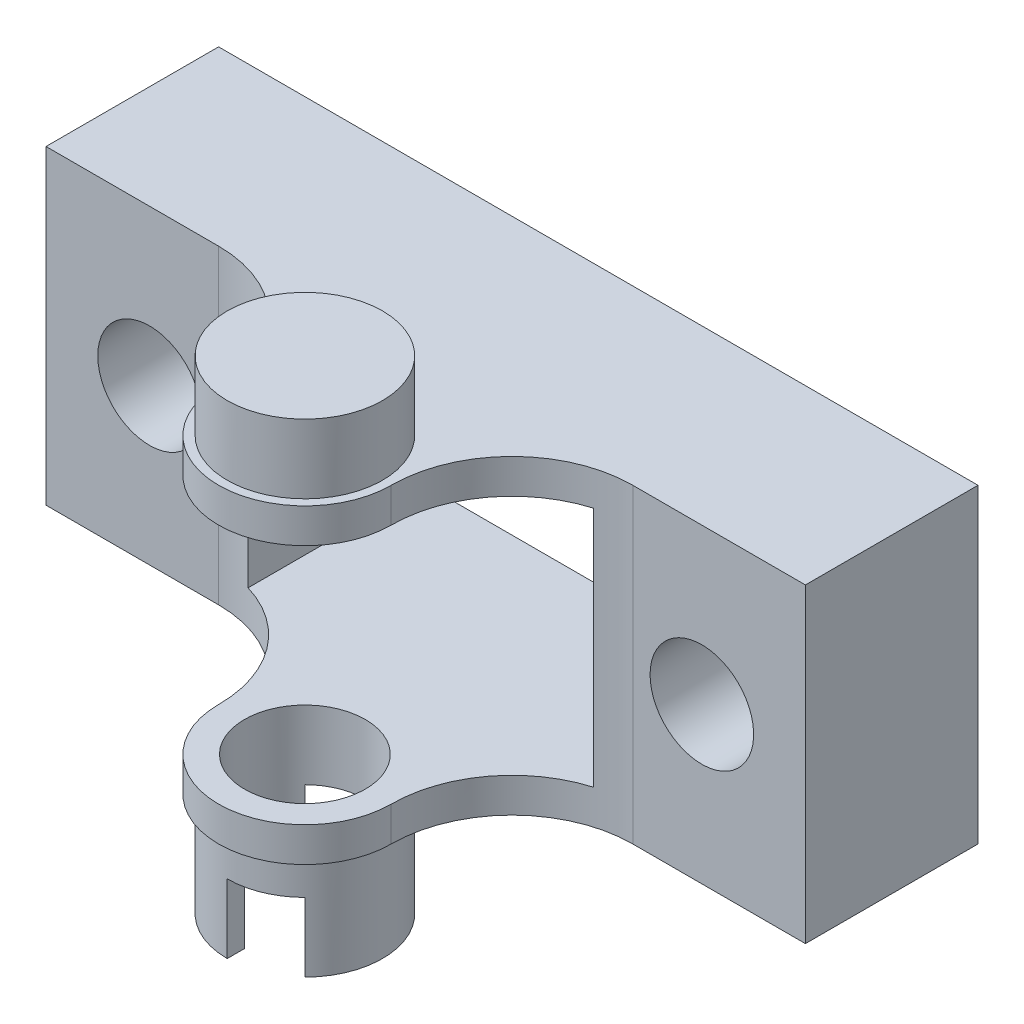
ISO-10303-21;
HEADER;
FILE_DESCRIPTION(('STEP AP214'),'2;1');
FILE_NAME('part.step','',(''),(''),'','','');
FILE_SCHEMA(('AUTOMOTIVE_DESIGN { 1 0 10303 214 1 1 1 1 }'));
ENDSEC;
DATA;
#1=APPLICATION_CONTEXT('core data for automotive mechanical design processes');
#2=APPLICATION_PROTOCOL_DEFINITION('international standard','automotive_design',2000,#1);
#3=PRODUCT_CONTEXT('',#1,'mechanical');
#4=PRODUCT('Part','Part','',(#3));
#5=PRODUCT_RELATED_PRODUCT_CATEGORY('part','',(#4));
#6=PRODUCT_DEFINITION_FORMATION('','',#4);
#7=PRODUCT_DEFINITION_CONTEXT('part definition',#1,'design');
#8=PRODUCT_DEFINITION('design','',#6,#7);
#9=PRODUCT_DEFINITION_SHAPE('','',#8);
#10=(LENGTH_UNIT() NAMED_UNIT(*) SI_UNIT(.MILLI.,.METRE.));
#11=(NAMED_UNIT(*) PLANE_ANGLE_UNIT() SI_UNIT($,.RADIAN.));
#12=(NAMED_UNIT(*) SI_UNIT($,.STERADIAN.) SOLID_ANGLE_UNIT());
#13=UNCERTAINTY_MEASURE_WITH_UNIT(LENGTH_MEASURE(1.E-05),#10,'distance_accuracy_value','');
#14=(GEOMETRIC_REPRESENTATION_CONTEXT(3) GLOBAL_UNCERTAINTY_ASSIGNED_CONTEXT((#13)) GLOBAL_UNIT_ASSIGNED_CONTEXT((#10,
#11,#12)) REPRESENTATION_CONTEXT('',''));
#15=CARTESIAN_POINT('',(0.,0.,0.));
#16=DIRECTION('',(0.,0.,1.));
#17=DIRECTION('',(1.,0.,0.));
#18=AXIS2_PLACEMENT_3D('',#15,#16,#17);
#19=CARTESIAN_POINT('',(36.,0.,14.5));
#20=DIRECTION('',(0.,1.,0.));
#21=DIRECTION('',(0.,0.,1.));
#22=AXIS2_PLACEMENT_3D('',#19,#20,#21);
#23=CYLINDRICAL_SURFACE('',#22,1.75);
#24=CARTESIAN_POINT('',(36.,339.,14.5));
#25=DIRECTION('',(0.,1.,0.));
#26=DIRECTION('',(0.,0.,1.));
#27=AXIS2_PLACEMENT_3D('',#24,#25,#26);
#28=CIRCLE('',#27,1.75);
#29=CARTESIAN_POINT('',(36.,339.,16.25));
#30=VERTEX_POINT('',#29);
#31=EDGE_CURVE('E385',#30,#30,#28,.T.);
#32=ORIENTED_EDGE('',*,*,#31,.F.);
#33=EDGE_LOOP('',(#32));
#34=FACE_BOUND('',#33,.T.);
#35=CARTESIAN_POINT('',(36.,341.,14.5));
#36=DIRECTION('',(0.,1.,0.));
#37=DIRECTION('',(0.,0.,1.));
#38=AXIS2_PLACEMENT_3D('',#35,#36,#37);
#39=CIRCLE('',#38,1.75);
#40=CARTESIAN_POINT('',(36.,341.,16.25));
#41=VERTEX_POINT('',#40);
#42=EDGE_CURVE('E14',#41,#41,#39,.F.);
#43=ORIENTED_EDGE('',*,*,#42,.F.);
#44=EDGE_LOOP('',(#43));
#45=FACE_BOUND('',#44,.T.);
#46=ADVANCED_FACE('F107',(#34,#45),#23,.F.);
#47=CARTESIAN_POINT('',(36.,343.,14.5));
#48=DIRECTION('',(0.,-1.,0.));
#49=DIRECTION('',(0.,0.,-1.));
#50=AXIS2_PLACEMENT_3D('',#47,#48,#49);
#51=CYLINDRICAL_SURFACE('',#50,2.25);
#52=CARTESIAN_POINT('',(36.,340.,14.5));
#53=DIRECTION('',(0.,-1.,0.));
#54=DIRECTION('',(0.,0.,-1.));
#55=AXIS2_PLACEMENT_3D('',#52,#53,#54);
#56=CIRCLE('',#55,2.25);
#57=CARTESIAN_POINT('',(36.,340.,12.25));
#58=VERTEX_POINT('',#57);
#59=EDGE_CURVE('E442',#58,#58,#56,.F.);
#60=ORIENTED_EDGE('',*,*,#59,.T.);
#61=EDGE_LOOP('',(#60));
#62=FACE_BOUND('',#61,.T.);
#63=CARTESIAN_POINT('',(36.,342.,14.5));
#64=DIRECTION('',(0.,1.,0.));
#65=DIRECTION('',(0.,0.,1.));
#66=AXIS2_PLACEMENT_3D('',#63,#64,#65);
#67=CIRCLE('',#66,2.25);
#68=CARTESIAN_POINT('',(36.,342.,16.75));
#69=VERTEX_POINT('',#68);
#70=EDGE_CURVE('E316',#69,#69,#67,.T.);
#71=ORIENTED_EDGE('',*,*,#70,.F.);
#72=EDGE_LOOP('',(#71));
#73=FACE_BOUND('',#72,.T.);
#74=ADVANCED_FACE('F463',(#62,#73),#51,.T.);
#75=CARTESIAN_POINT('',(36.,332.,14.5));
#76=DIRECTION('',(0.,-1.,0.));
#77=DIRECTION('',(0.,0.,-1.));
#78=AXIS2_PLACEMENT_3D('',#75,#76,#77);
#79=CIRCLE('',#78,1.75);
#80=CARTESIAN_POINT('',(36.,332.,12.75));
#81=VERTEX_POINT('',#80);
#82=EDGE_CURVE('E389',#81,#81,#79,.T.);
#83=ORIENTED_EDGE('',*,*,#82,.F.);
#84=EDGE_LOOP('',(#83));
#85=FACE_BOUND('',#84,.T.);
#86=DIRECTION('',(0.,-1.,0.));
#87=VECTOR('',#86,1.);
#88=CARTESIAN_POINT('',(36.,330.,16.25));
#89=LINE('',#88,#87);
#90=CARTESIAN_POINT('',(36.,330.,16.25));
#91=VERTEX_POINT('',#90);
#92=CARTESIAN_POINT('',(36.,328.,16.25));
#93=VERTEX_POINT('',#92);
#94=EDGE_CURVE('E337',#91,#93,#89,.T.);
#95=ORIENTED_EDGE('',*,*,#94,.T.);
#96=CARTESIAN_POINT('',(36.,328.,14.5));
#97=DIRECTION('',(0.,-1.,0.));
#98=DIRECTION('',(0.,0.,-1.));
#99=AXIS2_PLACEMENT_3D('',#96,#97,#98);
#100=CIRCLE('',#99,1.75);
#101=CARTESIAN_POINT('',(34.7625631329235,328.,13.2625631329235));
#102=VERTEX_POINT('',#101);
#103=EDGE_CURVE('E340',#93,#102,#100,.T.);
#104=ORIENTED_EDGE('',*,*,#103,.T.);
#105=DIRECTION('',(0.,-1.,0.));
#106=VECTOR('',#105,1.);
#107=CARTESIAN_POINT('',(34.7625631329235,330.,13.2625631329235));
#108=LINE('',#107,#106);
#109=CARTESIAN_POINT('',(34.7625631329235,330.,13.2625631329235));
#110=VERTEX_POINT('',#109);
#111=EDGE_CURVE('E122',#110,#102,#108,.T.);
#112=ORIENTED_EDGE('',*,*,#111,.F.);
#113=CARTESIAN_POINT('',(36.,330.,14.5));
#114=DIRECTION('',(0.,-1.,0.));
#115=DIRECTION('',(0.,0.,-1.));
#116=AXIS2_PLACEMENT_3D('',#113,#114,#115);
#117=CIRCLE('',#116,1.75);
#118=CARTESIAN_POINT('',(36.,330.,12.75));
#119=VERTEX_POINT('',#118);
#120=EDGE_CURVE('E347',#119,#110,#117,.F.);
#121=ORIENTED_EDGE('',*,*,#120,.F.);
#122=DIRECTION('',(0.,-1.,0.));
#123=VECTOR('',#122,1.);
#124=CARTESIAN_POINT('',(36.,330.,12.75));
#125=LINE('',#124,#123);
#126=CARTESIAN_POINT('',(36.,328.,12.75));
#127=VERTEX_POINT('',#126);
#128=EDGE_CURVE('E334',#119,#127,#125,.T.);
#129=ORIENTED_EDGE('',*,*,#128,.T.);
#130=CARTESIAN_POINT('',(37.2374368670765,328.,15.7374368670765));
#131=VERTEX_POINT('',#130);
#132=EDGE_CURVE('E370',#127,#131,#100,.T.);
#133=ORIENTED_EDGE('',*,*,#132,.T.);
#134=DIRECTION('',(0.,-1.,0.));
#135=VECTOR('',#134,1.);
#136=CARTESIAN_POINT('',(37.2374368670765,330.,15.7374368670765));
#137=LINE('',#136,#135);
#138=CARTESIAN_POINT('',(37.2374368670765,330.,15.7374368670765));
#139=VERTEX_POINT('',#138);
#140=EDGE_CURVE('E130',#139,#131,#137,.T.);
#141=ORIENTED_EDGE('',*,*,#140,.F.);
#142=CARTESIAN_POINT('',(36.,330.,14.5));
#143=DIRECTION('',(0.,-1.,0.));
#144=DIRECTION('',(0.,0.,-1.));
#145=AXIS2_PLACEMENT_3D('',#142,#143,#144);
#146=CIRCLE('',#145,1.75);
#147=EDGE_CURVE('E320',#91,#139,#146,.F.);
#148=ORIENTED_EDGE('',*,*,#147,.F.);
#149=EDGE_LOOP('',(#95,#104,#112,#121,#129,#133,#141,#148));
#150=FACE_BOUND('',#149,.T.);
#151=ADVANCED_FACE('F466',(#85,#150),#23,.F.);
#152=CARTESIAN_POINT('',(36.,328.,14.5));
#153=DIRECTION('',(0.,1.,0.));
#154=DIRECTION('',(0.,0.,1.));
#155=AXIS2_PLACEMENT_3D('',#152,#153,#154);
#156=CYLINDRICAL_SURFACE('',#155,2.25);
#157=CARTESIAN_POINT('',(36.,331.,14.5));
#158=DIRECTION('',(0.,1.,0.));
#159=DIRECTION('',(0.,0.,1.));
#160=AXIS2_PLACEMENT_3D('',#157,#158,#159);
#161=CIRCLE('',#160,2.25);
#162=CARTESIAN_POINT('',(36.,331.,16.75));
#163=VERTEX_POINT('',#162);
#164=EDGE_CURVE('E115',#163,#163,#161,.F.);
#165=ORIENTED_EDGE('',*,*,#164,.T.);
#166=EDGE_LOOP('',(#165));
#167=FACE_BOUND('',#166,.T.);
#168=DIRECTION('',(0.,-1.,0.));
#169=VECTOR('',#168,1.);
#170=CARTESIAN_POINT('',(36.,330.,16.75));
#171=LINE('',#170,#169);
#172=CARTESIAN_POINT('',(36.,330.,16.75));
#173=VERTEX_POINT('',#172);
#174=CARTESIAN_POINT('',(36.,328.,16.75));
#175=VERTEX_POINT('',#174);
#176=EDGE_CURVE('E341',#173,#175,#171,.T.);
#177=ORIENTED_EDGE('',*,*,#176,.F.);
#178=CARTESIAN_POINT('',(36.,330.,14.5));
#179=DIRECTION('',(0.,-1.,0.));
#180=DIRECTION('',(0.,0.,-1.));
#181=AXIS2_PLACEMENT_3D('',#178,#179,#180);
#182=CIRCLE('',#181,2.25);
#183=CARTESIAN_POINT('',(37.5909902576697,330.,16.0909902576697));
#184=VERTEX_POINT('',#183);
#185=EDGE_CURVE('E327',#184,#173,#182,.T.);
#186=ORIENTED_EDGE('',*,*,#185,.F.);
#187=DIRECTION('',(0.,-1.,0.));
#188=VECTOR('',#187,1.);
#189=CARTESIAN_POINT('',(37.5909902576697,330.,16.0909902576697));
#190=LINE('',#189,#188);
#191=CARTESIAN_POINT('',(37.5909902576697,328.,16.0909902576697));
#192=VERTEX_POINT('',#191);
#193=EDGE_CURVE('E343',#184,#192,#190,.T.);
#194=ORIENTED_EDGE('',*,*,#193,.T.);
#195=CARTESIAN_POINT('',(36.,328.,14.5));
#196=DIRECTION('',(0.,-1.,0.));
#197=DIRECTION('',(0.,0.,-1.));
#198=AXIS2_PLACEMENT_3D('',#195,#196,#197);
#199=CIRCLE('',#198,2.25);
#200=CARTESIAN_POINT('',(36.,328.,12.25));
#201=VERTEX_POINT('',#200);
#202=EDGE_CURVE('E374',#201,#192,#199,.T.);
#203=ORIENTED_EDGE('',*,*,#202,.F.);
#204=DIRECTION('',(0.,-1.,0.));
#205=VECTOR('',#204,1.);
#206=CARTESIAN_POINT('',(36.,330.,12.25));
#207=LINE('',#206,#205);
#208=CARTESIAN_POINT('',(36.,330.,12.25));
#209=VERTEX_POINT('',#208);
#210=EDGE_CURVE('E364',#209,#201,#207,.T.);
#211=ORIENTED_EDGE('',*,*,#210,.F.);
#212=CARTESIAN_POINT('',(36.,330.,14.5));
#213=DIRECTION('',(0.,-1.,0.));
#214=DIRECTION('',(0.,0.,-1.));
#215=AXIS2_PLACEMENT_3D('',#212,#213,#214);
#216=CIRCLE('',#215,2.25);
#217=CARTESIAN_POINT('',(34.4090097423303,330.,12.9090097423303));
#218=VERTEX_POINT('',#217);
#219=EDGE_CURVE('E354',#218,#209,#216,.T.);
#220=ORIENTED_EDGE('',*,*,#219,.F.);
#221=DIRECTION('',(0.,-1.,0.));
#222=VECTOR('',#221,1.);
#223=CARTESIAN_POINT('',(34.4090097423303,330.,12.9090097423303));
#224=LINE('',#223,#222);
#225=CARTESIAN_POINT('',(34.4090097423303,328.,12.9090097423303));
#226=VERTEX_POINT('',#225);
#227=EDGE_CURVE('E366',#218,#226,#224,.T.);
#228=ORIENTED_EDGE('',*,*,#227,.T.);
#229=EDGE_CURVE('E373',#175,#226,#199,.T.);
#230=ORIENTED_EDGE('',*,*,#229,.F.);
#231=EDGE_LOOP('',(#177,#186,#194,#203,#211,#220,#228,#230));
#232=FACE_BOUND('',#231,.T.);
#233=ADVANCED_FACE('F447',(#167,#232),#156,.T.);
#234=CARTESIAN_POINT('',(36.,328.,14.5));
#235=DIRECTION('',(0.,-1.,0.));
#236=DIRECTION('',(0.,0.,-1.));
#237=AXIS2_PLACEMENT_3D('',#234,#235,#236);
#238=PLANE('',#237);
#239=ORIENTED_EDGE('',*,*,#103,.F.);
#240=DIRECTION('',(0.,0.,1.));
#241=VECTOR('',#240,1.);
#242=CARTESIAN_POINT('',(36.,328.,0.));
#243=LINE('',#242,#241);
#244=EDGE_CURVE('E324',#93,#175,#243,.T.);
#245=ORIENTED_EDGE('',*,*,#244,.T.);
#246=ORIENTED_EDGE('',*,*,#229,.T.);
#247=DIRECTION('',(-0.707106781186551,0.,-0.707106781186544));
#248=VECTOR('',#247,1.);
#249=CARTESIAN_POINT('',(10.7499999999998,328.,-10.7499999999999));
#250=LINE('',#249,#248);
#251=EDGE_CURVE('E319',#102,#226,#250,.T.);
#252=ORIENTED_EDGE('',*,*,#251,.F.);
#253=EDGE_LOOP('',(#239,#245,#246,#252));
#254=FACE_BOUND('',#253,.T.);
#255=ADVANCED_FACE('F459',(#254),#238,.T.);
#256=DIRECTION('',(0.707106781186549,0.,0.707106781186546));
#257=VECTOR('',#256,1.);
#258=CARTESIAN_POINT('',(10.7499999999999,328.,-10.75));
#259=LINE('',#258,#257);
#260=EDGE_CURVE('E332',#131,#192,#259,.T.);
#261=ORIENTED_EDGE('',*,*,#260,.F.);
#262=ORIENTED_EDGE('',*,*,#132,.F.);
#263=DIRECTION('',(0.,0.,-1.));
#264=VECTOR('',#263,1.);
#265=CARTESIAN_POINT('',(36.,328.,0.));
#266=LINE('',#265,#264);
#267=EDGE_CURVE('E351',#127,#201,#266,.T.);
#268=ORIENTED_EDGE('',*,*,#267,.T.);
#269=ORIENTED_EDGE('',*,*,#202,.T.);
#270=EDGE_LOOP('',(#261,#262,#268,#269));
#271=FACE_BOUND('',#270,.T.);
#272=ADVANCED_FACE('F452',(#271),#238,.T.);
#273=CARTESIAN_POINT('',(30.,331.,17.));
#274=DIRECTION('',(0.,1.,0.));
#275=DIRECTION('',(0.,0.,1.));
#276=AXIS2_PLACEMENT_3D('',#273,#274,#275);
#277=PLANE('',#276);
#278=ORIENTED_EDGE('',*,*,#164,.F.);
#279=EDGE_LOOP('',(#278));
#280=FACE_BOUND('',#279,.T.);
#281=CARTESIAN_POINT('',(42.,331.,14.5));
#282=DIRECTION('',(0.,1.,0.));
#283=DIRECTION('',(0.,0.,1.));
#284=AXIS2_PLACEMENT_3D('',#281,#282,#283);
#285=CIRCLE('',#284,3.5);
#286=CARTESIAN_POINT('',(42.,331.,11.));
#287=VERTEX_POINT('',#286);
#288=CARTESIAN_POINT('',(38.5,331.,14.5));
#289=VERTEX_POINT('',#288);
#290=EDGE_CURVE('E395',#287,#289,#285,.T.);
#291=ORIENTED_EDGE('',*,*,#290,.T.);
#292=CARTESIAN_POINT('',(36.,331.,14.5));
#293=DIRECTION('',(0.,1.,0.));
#294=DIRECTION('',(0.,0.,1.));
#295=AXIS2_PLACEMENT_3D('',#292,#293,#294);
#296=CIRCLE('',#295,2.5);
#297=CARTESIAN_POINT('',(33.5,331.,14.5));
#298=VERTEX_POINT('',#297);
#299=EDGE_CURVE('E409',#298,#289,#296,.T.);
#300=ORIENTED_EDGE('',*,*,#299,.F.);
#301=CARTESIAN_POINT('',(30.,331.,14.5));
#302=DIRECTION('',(0.,1.,0.));
#303=DIRECTION('',(0.,0.,1.));
#304=AXIS2_PLACEMENT_3D('',#301,#302,#303);
#305=CIRCLE('',#304,3.5);
#306=CARTESIAN_POINT('',(30.,331.,11.));
#307=VERTEX_POINT('',#306);
#308=EDGE_CURVE('E417',#298,#307,#305,.T.);
#309=ORIENTED_EDGE('',*,*,#308,.T.);
#310=DIRECTION('',(1.,0.,0.));
#311=VECTOR('',#310,1.);
#312=CARTESIAN_POINT('',(25.,331.,11.));
#313=LINE('',#312,#311);
#314=CARTESIAN_POINT('',(25.,331.,11.));
#315=VERTEX_POINT('',#314);
#316=EDGE_CURVE('E299',#315,#307,#313,.T.);
#317=ORIENTED_EDGE('',*,*,#316,.F.);
#318=DIRECTION('',(0.,0.,1.));
#319=VECTOR('',#318,1.);
#320=CARTESIAN_POINT('',(25.,331.,6.));
#321=LINE('',#320,#319);
#322=CARTESIAN_POINT('',(25.,331.,6.));
#323=VERTEX_POINT('',#322);
#324=EDGE_CURVE('E285',#323,#315,#321,.T.);
#325=ORIENTED_EDGE('',*,*,#324,.F.);
#326=DIRECTION('',(-1.,0.,0.));
#327=VECTOR('',#326,1.);
#328=CARTESIAN_POINT('',(42.,331.,6.));
#329=LINE('',#328,#327);
#330=CARTESIAN_POINT('',(47.,331.,6.));
#331=VERTEX_POINT('',#330);
#332=EDGE_CURVE('E262',#331,#323,#329,.T.);
#333=ORIENTED_EDGE('',*,*,#332,.F.);
#334=DIRECTION('',(0.,0.,-1.));
#335=VECTOR('',#334,1.);
#336=CARTESIAN_POINT('',(47.,331.,11.));
#337=LINE('',#336,#335);
#338=CARTESIAN_POINT('',(47.,331.,11.));
#339=VERTEX_POINT('',#338);
#340=EDGE_CURVE('E255',#339,#331,#337,.T.);
#341=ORIENTED_EDGE('',*,*,#340,.F.);
#342=DIRECTION('',(-1.,0.,0.));
#343=VECTOR('',#342,1.);
#344=CARTESIAN_POINT('',(47.,331.,11.));
#345=LINE('',#344,#343);
#346=EDGE_CURVE('E259',#339,#287,#345,.T.);
#347=ORIENTED_EDGE('',*,*,#346,.T.);
#348=EDGE_LOOP('',(#291,#300,#309,#317,#325,#333,#341,#347));
#349=FACE_BOUND('',#348,.T.);
#350=ADVANCED_FACE('F109',(#280,#349),#277,.F.);
#351=CARTESIAN_POINT('',(30.,340.,17.));
#352=DIRECTION('',(0.,-1.,0.));
#353=DIRECTION('',(0.,0.,-1.));
#354=AXIS2_PLACEMENT_3D('',#351,#352,#353);
#355=PLANE('',#354);
#356=ORIENTED_EDGE('',*,*,#59,.F.);
#357=EDGE_LOOP('',(#356));
#358=FACE_BOUND('',#357,.T.);
#359=CARTESIAN_POINT('',(36.,340.,14.5));
#360=DIRECTION('',(0.,1.,0.));
#361=DIRECTION('',(0.,0.,1.));
#362=AXIS2_PLACEMENT_3D('',#359,#360,#361);
#363=CIRCLE('',#362,2.5);
#364=CARTESIAN_POINT('',(33.5,340.,14.5));
#365=VERTEX_POINT('',#364);
#366=CARTESIAN_POINT('',(38.5,340.,14.5));
#367=VERTEX_POINT('',#366);
#368=EDGE_CURVE('E397',#365,#367,#363,.T.);
#369=ORIENTED_EDGE('',*,*,#368,.T.);
#370=CARTESIAN_POINT('',(42.,340.,14.5));
#371=DIRECTION('',(0.,1.,0.));
#372=DIRECTION('',(0.,0.,1.));
#373=AXIS2_PLACEMENT_3D('',#370,#371,#372);
#374=CIRCLE('',#373,3.5);
#375=CARTESIAN_POINT('',(42.,340.,11.));
#376=VERTEX_POINT('',#375);
#377=EDGE_CURVE('E377',#376,#367,#374,.T.);
#378=ORIENTED_EDGE('',*,*,#377,.F.);
#379=DIRECTION('',(-1.,0.,0.));
#380=VECTOR('',#379,1.);
#381=CARTESIAN_POINT('',(47.,340.,11.));
#382=LINE('',#381,#380);
#383=CARTESIAN_POINT('',(47.,340.,11.));
#384=VERTEX_POINT('',#383);
#385=EDGE_CURVE('E282',#384,#376,#382,.T.);
#386=ORIENTED_EDGE('',*,*,#385,.F.);
#387=DIRECTION('',(0.,0.,1.));
#388=VECTOR('',#387,1.);
#389=CARTESIAN_POINT('',(47.,340.,11.));
#390=LINE('',#389,#388);
#391=CARTESIAN_POINT('',(47.,340.,6.));
#392=VERTEX_POINT('',#391);
#393=EDGE_CURVE('E272',#392,#384,#390,.T.);
#394=ORIENTED_EDGE('',*,*,#393,.F.);
#395=DIRECTION('',(1.,0.,0.));
#396=VECTOR('',#395,1.);
#397=CARTESIAN_POINT('',(42.,340.,6.));
#398=LINE('',#397,#396);
#399=CARTESIAN_POINT('',(25.,340.,6.));
#400=VERTEX_POINT('',#399);
#401=EDGE_CURVE('E314',#400,#392,#398,.T.);
#402=ORIENTED_EDGE('',*,*,#401,.F.);
#403=DIRECTION('',(0.,0.,-1.));
#404=VECTOR('',#403,1.);
#405=CARTESIAN_POINT('',(25.,340.,6.));
#406=LINE('',#405,#404);
#407=CARTESIAN_POINT('',(25.,340.,11.));
#408=VERTEX_POINT('',#407);
#409=EDGE_CURVE('E293',#408,#400,#406,.T.);
#410=ORIENTED_EDGE('',*,*,#409,.F.);
#411=DIRECTION('',(1.,0.,0.));
#412=VECTOR('',#411,1.);
#413=CARTESIAN_POINT('',(25.,340.,11.));
#414=LINE('',#413,#412);
#415=CARTESIAN_POINT('',(30.,340.,11.));
#416=VERTEX_POINT('',#415);
#417=EDGE_CURVE('E296',#408,#416,#414,.T.);
#418=ORIENTED_EDGE('',*,*,#417,.T.);
#419=CARTESIAN_POINT('',(30.,340.,14.5));
#420=DIRECTION('',(0.,1.,0.));
#421=DIRECTION('',(0.,0.,1.));
#422=AXIS2_PLACEMENT_3D('',#419,#420,#421);
#423=CIRCLE('',#422,3.5);
#424=EDGE_CURVE('E399',#365,#416,#423,.T.);
#425=ORIENTED_EDGE('',*,*,#424,.F.);
#426=EDGE_LOOP('',(#369,#378,#386,#394,#402,#410,#418,#425));
#427=FACE_BOUND('',#426,.T.);
#428=ADVANCED_FACE('F451',(#358,#427),#355,.F.);
#429=CARTESIAN_POINT('',(31.,339.,10.));
#430=DIRECTION('',(0.,1.,0.));
#431=DIRECTION('',(0.,0.,1.));
#432=AXIS2_PLACEMENT_3D('',#429,#430,#431);
#433=PLANE('',#432);
#434=ORIENTED_EDGE('',*,*,#31,.T.);
#435=EDGE_LOOP('',(#434));
#436=FACE_BOUND('',#435,.T.);
#437=CARTESIAN_POINT('',(42.,339.,14.5));
#438=DIRECTION('',(0.,1.,0.));
#439=DIRECTION('',(0.,0.,1.));
#440=AXIS2_PLACEMENT_3D('',#437,#438,#439);
#441=CIRCLE('',#440,3.5);
#442=CARTESIAN_POINT('',(41.,339.,11.1458980337503));
#443=VERTEX_POINT('',#442);
#444=CARTESIAN_POINT('',(38.5,339.,14.5));
#445=VERTEX_POINT('',#444);
#446=EDGE_CURVE('E392',#443,#445,#441,.T.);
#447=ORIENTED_EDGE('',*,*,#446,.T.);
#448=CARTESIAN_POINT('',(36.,339.,14.5));
#449=DIRECTION('',(0.,1.,0.));
#450=DIRECTION('',(0.,0.,1.));
#451=AXIS2_PLACEMENT_3D('',#448,#449,#450);
#452=CIRCLE('',#451,2.5);
#453=CARTESIAN_POINT('',(33.5,339.,14.5));
#454=VERTEX_POINT('',#453);
#455=EDGE_CURVE('E405',#454,#445,#452,.T.);
#456=ORIENTED_EDGE('',*,*,#455,.F.);
#457=CARTESIAN_POINT('',(30.,339.,14.5));
#458=DIRECTION('',(0.,1.,0.));
#459=DIRECTION('',(0.,0.,1.));
#460=AXIS2_PLACEMENT_3D('',#457,#458,#459);
#461=CIRCLE('',#460,3.5);
#462=CARTESIAN_POINT('',(31.,339.,11.1458980337503));
#463=VERTEX_POINT('',#462);
#464=EDGE_CURVE('E414',#454,#463,#461,.T.);
#465=ORIENTED_EDGE('',*,*,#464,.T.);
#466=DIRECTION('',(0.,0.,1.));
#467=VECTOR('',#466,1.);
#468=CARTESIAN_POINT('',(31.,339.,10.));
#469=LINE('',#468,#467);
#470=CARTESIAN_POINT('',(31.,339.,6.));
#471=VERTEX_POINT('',#470);
#472=EDGE_CURVE('E421',#471,#463,#469,.T.);
#473=ORIENTED_EDGE('',*,*,#472,.F.);
#474=DIRECTION('',(1.,0.,0.));
#475=VECTOR('',#474,1.);
#476=CARTESIAN_POINT('',(41.,339.,6.));
#477=LINE('',#476,#475);
#478=CARTESIAN_POINT('',(41.,339.,6.));
#479=VERTEX_POINT('',#478);
#480=EDGE_CURVE('E310',#471,#479,#477,.T.);
#481=ORIENTED_EDGE('',*,*,#480,.T.);
#482=DIRECTION('',(0.,0.,1.));
#483=VECTOR('',#482,1.);
#484=CARTESIAN_POINT('',(41.,339.,10.));
#485=LINE('',#484,#483);
#486=EDGE_CURVE('E425',#479,#443,#485,.T.);
#487=ORIENTED_EDGE('',*,*,#486,.T.);
#488=EDGE_LOOP('',(#447,#456,#465,#473,#481,#487));
#489=FACE_BOUND('',#488,.T.);
#490=ADVANCED_FACE('F457',(#436,#489),#433,.F.);
#491=CARTESIAN_POINT('',(31.,332.,10.));
#492=DIRECTION('',(0.,-1.,0.));
#493=DIRECTION('',(0.,0.,-1.));
#494=AXIS2_PLACEMENT_3D('',#491,#492,#493);
#495=PLANE('',#494);
#496=ORIENTED_EDGE('',*,*,#82,.T.);
#497=EDGE_LOOP('',(#496));
#498=FACE_BOUND('',#497,.T.);
#499=CARTESIAN_POINT('',(36.,332.,14.5));
#500=DIRECTION('',(0.,-1.,0.));
#501=DIRECTION('',(0.,0.,-1.));
#502=AXIS2_PLACEMENT_3D('',#499,#500,#501);
#503=CIRCLE('',#502,2.5);
#504=CARTESIAN_POINT('',(38.5,332.,14.5));
#505=VERTEX_POINT('',#504);
#506=CARTESIAN_POINT('',(33.5,332.,14.5));
#507=VERTEX_POINT('',#506);
#508=EDGE_CURVE('E424',#505,#507,#503,.T.);
#509=ORIENTED_EDGE('',*,*,#508,.F.);
#510=CARTESIAN_POINT('',(42.,332.,14.5));
#511=DIRECTION('',(0.,-1.,0.));
#512=DIRECTION('',(0.,0.,-1.));
#513=AXIS2_PLACEMENT_3D('',#510,#511,#512);
#514=CIRCLE('',#513,3.5);
#515=CARTESIAN_POINT('',(41.,332.,11.1458980337503));
#516=VERTEX_POINT('',#515);
#517=EDGE_CURVE('E437',#505,#516,#514,.T.);
#518=ORIENTED_EDGE('',*,*,#517,.T.);
#519=DIRECTION('',(0.,0.,1.));
#520=VECTOR('',#519,1.);
#521=CARTESIAN_POINT('',(41.,332.,10.));
#522=LINE('',#521,#520);
#523=CARTESIAN_POINT('',(41.,332.,6.));
#524=VERTEX_POINT('',#523);
#525=EDGE_CURVE('E428',#524,#516,#522,.T.);
#526=ORIENTED_EDGE('',*,*,#525,.F.);
#527=DIRECTION('',(-1.,0.,0.));
#528=VECTOR('',#527,1.);
#529=CARTESIAN_POINT('',(41.,332.,6.));
#530=LINE('',#529,#528);
#531=CARTESIAN_POINT('',(31.,332.,6.));
#532=VERTEX_POINT('',#531);
#533=EDGE_CURVE('E304',#524,#532,#530,.T.);
#534=ORIENTED_EDGE('',*,*,#533,.T.);
#535=DIRECTION('',(0.,0.,1.));
#536=VECTOR('',#535,1.);
#537=CARTESIAN_POINT('',(31.,332.,10.));
#538=LINE('',#537,#536);
#539=CARTESIAN_POINT('',(31.,332.,11.1458980337503));
#540=VERTEX_POINT('',#539);
#541=EDGE_CURVE('E420',#532,#540,#538,.T.);
#542=ORIENTED_EDGE('',*,*,#541,.T.);
#543=CARTESIAN_POINT('',(30.,332.,14.5));
#544=DIRECTION('',(0.,-1.,0.));
#545=DIRECTION('',(0.,0.,-1.));
#546=AXIS2_PLACEMENT_3D('',#543,#544,#545);
#547=CIRCLE('',#546,3.5);
#548=EDGE_CURVE('E434',#540,#507,#547,.T.);
#549=ORIENTED_EDGE('',*,*,#548,.T.);
#550=EDGE_LOOP('',(#509,#518,#526,#534,#542,#549));
#551=FACE_BOUND('',#550,.T.);
#552=ADVANCED_FACE('F551',(#498,#551),#495,.F.);
#553=CARTESIAN_POINT('',(31.,339.,10.));
#554=DIRECTION('',(-1.,0.,0.));
#555=DIRECTION('',(0.,0.,1.));
#556=AXIS2_PLACEMENT_3D('',#553,#554,#555);
#557=PLANE('',#556);
#558=ORIENTED_EDGE('',*,*,#472,.T.);
#559=DIRECTION('',(0.,1.,0.));
#560=VECTOR('',#559,1.);
#561=CARTESIAN_POINT('',(31.,0.,11.1458980337503));
#562=LINE('',#561,#560);
#563=EDGE_CURVE('E411',#463,#540,#562,.F.);
#564=ORIENTED_EDGE('',*,*,#563,.T.);
#565=ORIENTED_EDGE('',*,*,#541,.F.);
#566=DIRECTION('',(0.,1.,0.));
#567=VECTOR('',#566,1.);
#568=CARTESIAN_POINT('',(31.,339.,6.));
#569=LINE('',#568,#567);
#570=EDGE_CURVE('E307',#532,#471,#569,.T.);
#571=ORIENTED_EDGE('',*,*,#570,.T.);
#572=EDGE_LOOP('',(#558,#564,#565,#571));
#573=FACE_BOUND('',#572,.T.);
#574=ADVANCED_FACE('F691',(#573),#557,.F.);
#575=CARTESIAN_POINT('',(41.,339.,10.));
#576=DIRECTION('',(1.,0.,0.));
#577=DIRECTION('',(0.,0.,-1.));
#578=AXIS2_PLACEMENT_3D('',#575,#576,#577);
#579=PLANE('',#578);
#580=ORIENTED_EDGE('',*,*,#525,.T.);
#581=DIRECTION('',(0.,1.,0.));
#582=VECTOR('',#581,1.);
#583=CARTESIAN_POINT('',(41.,0.,11.1458980337503));
#584=LINE('',#583,#582);
#585=EDGE_CURVE('E388',#516,#443,#584,.T.);
#586=ORIENTED_EDGE('',*,*,#585,.T.);
#587=ORIENTED_EDGE('',*,*,#486,.F.);
#588=DIRECTION('',(0.,-1.,0.));
#589=VECTOR('',#588,1.);
#590=CARTESIAN_POINT('',(41.,339.,6.));
#591=LINE('',#590,#589);
#592=EDGE_CURVE('E301',#479,#524,#591,.T.);
#593=ORIENTED_EDGE('',*,*,#592,.T.);
#594=EDGE_LOOP('',(#580,#586,#587,#593));
#595=FACE_BOUND('',#594,.T.);
#596=ADVANCED_FACE('F546',(#595),#579,.F.);
#597=CARTESIAN_POINT('',(30.,0.,14.5));
#598=DIRECTION('',(0.,1.,0.));
#599=DIRECTION('',(0.,0.,1.));
#600=AXIS2_PLACEMENT_3D('',#597,#598,#599);
#601=CYLINDRICAL_SURFACE('',#600,3.5);
#602=DIRECTION('',(0.,1.,0.));
#603=VECTOR('',#602,1.);
#604=CARTESIAN_POINT('',(33.5,0.,14.5));
#605=LINE('',#604,#603);
#606=EDGE_CURVE('E406',#298,#507,#605,.T.);
#607=ORIENTED_EDGE('',*,*,#606,.T.);
#608=ORIENTED_EDGE('',*,*,#548,.F.);
#609=ORIENTED_EDGE('',*,*,#563,.F.);
#610=ORIENTED_EDGE('',*,*,#464,.F.);
#611=EDGE_CURVE('E402',#454,#365,#605,.T.);
#612=ORIENTED_EDGE('',*,*,#611,.T.);
#613=ORIENTED_EDGE('',*,*,#424,.T.);
#614=DIRECTION('',(0.,1.,0.));
#615=VECTOR('',#614,1.);
#616=CARTESIAN_POINT('',(30.,0.,11.));
#617=LINE('',#616,#615);
#618=EDGE_CURVE('E403',#307,#416,#617,.T.);
#619=ORIENTED_EDGE('',*,*,#618,.F.);
#620=ORIENTED_EDGE('',*,*,#308,.F.);
#621=EDGE_LOOP('',(#607,#608,#609,#610,#612,#613,#619,#620));
#622=FACE_BOUND('',#621,.T.);
#623=ADVANCED_FACE('F557',(#622),#601,.F.);
#624=CARTESIAN_POINT('',(36.,0.,14.5));
#625=DIRECTION('',(0.,1.,0.));
#626=DIRECTION('',(0.,0.,1.));
#627=AXIS2_PLACEMENT_3D('',#624,#625,#626);
#628=CYLINDRICAL_SURFACE('',#627,2.5);
#629=ORIENTED_EDGE('',*,*,#299,.T.);
#630=DIRECTION('',(0.,1.,0.));
#631=VECTOR('',#630,1.);
#632=CARTESIAN_POINT('',(38.5,0.,14.5));
#633=LINE('',#632,#631);
#634=EDGE_CURVE('E383',#289,#505,#633,.T.);
#635=ORIENTED_EDGE('',*,*,#634,.T.);
#636=ORIENTED_EDGE('',*,*,#508,.T.);
#637=ORIENTED_EDGE('',*,*,#606,.F.);
#638=EDGE_LOOP('',(#629,#635,#636,#637));
#639=FACE_BOUND('',#638,.T.);
#640=ADVANCED_FACE('F531',(#639),#628,.T.);
#641=ORIENTED_EDGE('',*,*,#455,.T.);
#642=EDGE_CURVE('E380',#445,#367,#633,.T.);
#643=ORIENTED_EDGE('',*,*,#642,.T.);
#644=ORIENTED_EDGE('',*,*,#368,.F.);
#645=ORIENTED_EDGE('',*,*,#611,.F.);
#646=EDGE_LOOP('',(#641,#643,#644,#645));
#647=FACE_BOUND('',#646,.T.);
#648=ADVANCED_FACE('F526',(#647),#628,.T.);
#649=CARTESIAN_POINT('',(42.,0.,14.5));
#650=DIRECTION('',(0.,1.,0.));
#651=DIRECTION('',(0.,0.,1.));
#652=AXIS2_PLACEMENT_3D('',#649,#650,#651);
#653=CYLINDRICAL_SURFACE('',#652,3.5);
#654=DIRECTION('',(0.,1.,0.));
#655=VECTOR('',#654,1.);
#656=CARTESIAN_POINT('',(42.,0.,11.));
#657=LINE('',#656,#655);
#658=EDGE_CURVE('E279',#287,#376,#657,.T.);
#659=ORIENTED_EDGE('',*,*,#658,.T.);
#660=ORIENTED_EDGE('',*,*,#377,.T.);
#661=ORIENTED_EDGE('',*,*,#642,.F.);
#662=ORIENTED_EDGE('',*,*,#446,.F.);
#663=ORIENTED_EDGE('',*,*,#585,.F.);
#664=ORIENTED_EDGE('',*,*,#517,.F.);
#665=ORIENTED_EDGE('',*,*,#634,.F.);
#666=ORIENTED_EDGE('',*,*,#290,.F.);
#667=EDGE_LOOP('',(#659,#660,#661,#662,#663,#664,#665,#666));
#668=FACE_BOUND('',#667,.T.);
#669=ADVANCED_FACE('F522',(#668),#653,.F.);
#670=CARTESIAN_POINT('',(36.,330.,0.));
#671=DIRECTION('',(-1.,0.,0.));
#672=DIRECTION('',(0.,0.,1.));
#673=AXIS2_PLACEMENT_3D('',#670,#671,#672);
#674=PLANE('',#673);
#675=ORIENTED_EDGE('',*,*,#267,.F.);
#676=ORIENTED_EDGE('',*,*,#128,.F.);
#677=DIRECTION('',(0.,0.,-1.));
#678=VECTOR('',#677,1.);
#679=CARTESIAN_POINT('',(36.,330.,0.));
#680=LINE('',#679,#678);
#681=EDGE_CURVE('E357',#119,#209,#680,.T.);
#682=ORIENTED_EDGE('',*,*,#681,.T.);
#683=ORIENTED_EDGE('',*,*,#210,.T.);
#684=EDGE_LOOP('',(#675,#676,#682,#683));
#685=FACE_BOUND('',#684,.T.);
#686=ADVANCED_FACE('F519',(#685),#674,.T.);
#687=CARTESIAN_POINT('',(10.7499999999998,330.,-10.7499999999999));
#688=DIRECTION('',(-0.707106781186544,0.,0.707106781186551));
#689=DIRECTION('',(0.707106781186551,0.,0.707106781186544));
#690=AXIS2_PLACEMENT_3D('',#687,#688,#689);
#691=PLANE('',#690);
#692=ORIENTED_EDGE('',*,*,#251,.T.);
#693=ORIENTED_EDGE('',*,*,#227,.F.);
#694=DIRECTION('',(-0.707106781186551,0.,-0.707106781186544));
#695=VECTOR('',#694,1.);
#696=CARTESIAN_POINT('',(10.7499999999998,330.,-10.7499999999999));
#697=LINE('',#696,#695);
#698=EDGE_CURVE('E350',#110,#218,#697,.T.);
#699=ORIENTED_EDGE('',*,*,#698,.F.);
#700=ORIENTED_EDGE('',*,*,#111,.T.);
#701=EDGE_LOOP('',(#692,#693,#699,#700));
#702=FACE_BOUND('',#701,.T.);
#703=ADVANCED_FACE('F492',(#702),#691,.F.);
#704=CARTESIAN_POINT('',(0.,330.,0.));
#705=DIRECTION('',(0.,-1.,0.));
#706=DIRECTION('',(0.,0.,-1.));
#707=AXIS2_PLACEMENT_3D('',#704,#705,#706);
#708=PLANE('',#707);
#709=ORIENTED_EDGE('',*,*,#120,.T.);
#710=ORIENTED_EDGE('',*,*,#698,.T.);
#711=ORIENTED_EDGE('',*,*,#219,.T.);
#712=ORIENTED_EDGE('',*,*,#681,.F.);
#713=EDGE_LOOP('',(#709,#710,#711,#712));
#714=FACE_BOUND('',#713,.T.);
#715=ADVANCED_FACE('F499',(#714),#708,.T.);
#716=CARTESIAN_POINT('',(36.,330.,0.));
#717=DIRECTION('',(1.,0.,0.));
#718=DIRECTION('',(0.,0.,-1.));
#719=AXIS2_PLACEMENT_3D('',#716,#717,#718);
#720=PLANE('',#719);
#721=ORIENTED_EDGE('',*,*,#244,.F.);
#722=ORIENTED_EDGE('',*,*,#94,.F.);
#723=DIRECTION('',(0.,0.,1.));
#724=VECTOR('',#723,1.);
#725=CARTESIAN_POINT('',(36.,330.,0.));
#726=LINE('',#725,#724);
#727=EDGE_CURVE('E330',#91,#173,#726,.T.);
#728=ORIENTED_EDGE('',*,*,#727,.T.);
#729=ORIENTED_EDGE('',*,*,#176,.T.);
#730=EDGE_LOOP('',(#721,#722,#728,#729));
#731=FACE_BOUND('',#730,.T.);
#732=ADVANCED_FACE('F507',(#731),#720,.T.);
#733=CARTESIAN_POINT('',(10.7499999999999,330.,-10.75));
#734=DIRECTION('',(0.707106781186546,0.,-0.707106781186549));
#735=DIRECTION('',(-0.707106781186549,0.,-0.707106781186546));
#736=AXIS2_PLACEMENT_3D('',#733,#734,#735);
#737=PLANE('',#736);
#738=ORIENTED_EDGE('',*,*,#260,.T.);
#739=ORIENTED_EDGE('',*,*,#193,.F.);
#740=DIRECTION('',(0.707106781186549,0.,0.707106781186546));
#741=VECTOR('',#740,1.);
#742=CARTESIAN_POINT('',(10.7499999999999,330.,-10.75));
#743=LINE('',#742,#741);
#744=EDGE_CURVE('E323',#139,#184,#743,.T.);
#745=ORIENTED_EDGE('',*,*,#744,.F.);
#746=ORIENTED_EDGE('',*,*,#140,.T.);
#747=EDGE_LOOP('',(#738,#739,#745,#746));
#748=FACE_BOUND('',#747,.T.);
#749=ADVANCED_FACE('F503',(#748),#737,.F.);
#750=CARTESIAN_POINT('',(0.,330.,0.));
#751=DIRECTION('',(0.,-1.,0.));
#752=DIRECTION('',(0.,0.,-1.));
#753=AXIS2_PLACEMENT_3D('',#750,#751,#752);
#754=PLANE('',#753);
#755=ORIENTED_EDGE('',*,*,#147,.T.);
#756=ORIENTED_EDGE('',*,*,#744,.T.);
#757=ORIENTED_EDGE('',*,*,#185,.T.);
#758=ORIENTED_EDGE('',*,*,#727,.F.);
#759=EDGE_LOOP('',(#755,#756,#757,#758));
#760=FACE_BOUND('',#759,.T.);
#761=ADVANCED_FACE('F506',(#760),#754,.T.);
#762=CARTESIAN_POINT('',(36.,342.,14.5));
#763=DIRECTION('',(0.,1.,0.));
#764=DIRECTION('',(0.,0.,1.));
#765=AXIS2_PLACEMENT_3D('',#762,#763,#764);
#766=PLANE('',#765);
#767=ORIENTED_EDGE('',*,*,#70,.T.);
#768=EDGE_LOOP('',(#767));
#769=FACE_BOUND('',#768,.T.);
#770=ADVANCED_FACE('F616',(#769),#766,.T.);
#771=CARTESIAN_POINT('',(36.,341.,14.5));
#772=DIRECTION('',(0.,1.,0.));
#773=DIRECTION('',(0.,0.,1.));
#774=AXIS2_PLACEMENT_3D('',#771,#772,#773);
#775=PLANE('',#774);
#776=ORIENTED_EDGE('',*,*,#42,.T.);
#777=EDGE_LOOP('',(#776));
#778=FACE_BOUND('',#777,.T.);
#779=ADVANCED_FACE('F595',(#778),#775,.F.);
#780=CARTESIAN_POINT('',(0.,0.,6.));
#781=DIRECTION('',(0.,0.,-1.));
#782=DIRECTION('',(-1.,0.,0.));
#783=AXIS2_PLACEMENT_3D('',#780,#781,#782);
#784=PLANE('',#783);
#785=CARTESIAN_POINT('',(28.,335.5,6.));
#786=DIRECTION('',(0.,0.,-1.));
#787=DIRECTION('',(-1.,0.,0.));
#788=AXIS2_PLACEMENT_3D('',#785,#786,#787);
#789=CIRCLE('',#788,1.5);
#790=CARTESIAN_POINT('',(26.5,335.5,6.));
#791=VERTEX_POINT('',#790);
#792=EDGE_CURVE('E579',#791,#791,#789,.T.);
#793=ORIENTED_EDGE('',*,*,#792,.F.);
#794=EDGE_LOOP('',(#793));
#795=FACE_BOUND('',#794,.T.);
#796=CARTESIAN_POINT('',(44.,335.5,6.));
#797=DIRECTION('',(0.,0.,-1.));
#798=DIRECTION('',(-1.,0.,0.));
#799=AXIS2_PLACEMENT_3D('',#796,#797,#798);
#800=CIRCLE('',#799,1.5);
#801=CARTESIAN_POINT('',(42.5,335.5,6.));
#802=VERTEX_POINT('',#801);
#803=EDGE_CURVE('E576',#802,#802,#800,.T.);
#804=ORIENTED_EDGE('',*,*,#803,.F.);
#805=EDGE_LOOP('',(#804));
#806=FACE_BOUND('',#805,.T.);
#807=ORIENTED_EDGE('',*,*,#401,.T.);
#808=DIRECTION('',(0.,1.,0.));
#809=VECTOR('',#808,1.);
#810=CARTESIAN_POINT('',(47.,340.,6.));
#811=LINE('',#810,#809);
#812=EDGE_CURVE('E266',#331,#392,#811,.T.);
#813=ORIENTED_EDGE('',*,*,#812,.F.);
#814=ORIENTED_EDGE('',*,*,#332,.T.);
#815=DIRECTION('',(0.,-1.,0.));
#816=VECTOR('',#815,1.);
#817=CARTESIAN_POINT('',(25.,340.,6.));
#818=LINE('',#817,#816);
#819=EDGE_CURVE('E281',#400,#323,#818,.T.);
#820=ORIENTED_EDGE('',*,*,#819,.F.);
#821=EDGE_LOOP('',(#807,#813,#814,#820));
#822=FACE_BOUND('',#821,.T.);
#823=ORIENTED_EDGE('',*,*,#533,.F.);
#824=ORIENTED_EDGE('',*,*,#592,.F.);
#825=ORIENTED_EDGE('',*,*,#480,.F.);
#826=ORIENTED_EDGE('',*,*,#570,.F.);
#827=EDGE_LOOP('',(#823,#824,#825,#826));
#828=FACE_BOUND('',#827,.T.);
#829=ADVANCED_FACE('F569',(#795,#806,#822,#828),#784,.T.);
#830=CARTESIAN_POINT('',(25.,340.,11.));
#831=DIRECTION('',(0.,0.,-1.));
#832=DIRECTION('',(-1.,0.,0.));
#833=AXIS2_PLACEMENT_3D('',#830,#831,#832);
#834=PLANE('',#833);
#835=CARTESIAN_POINT('',(28.,335.5,11.));
#836=DIRECTION('',(0.,0.,-1.));
#837=DIRECTION('',(-1.,0.,0.));
#838=AXIS2_PLACEMENT_3D('',#835,#836,#837);
#839=CIRCLE('',#838,1.5);
#840=CARTESIAN_POINT('',(26.5,335.5,11.));
#841=VERTEX_POINT('',#840);
#842=EDGE_CURVE('E275',#841,#841,#839,.T.);
#843=ORIENTED_EDGE('',*,*,#842,.T.);
#844=EDGE_LOOP('',(#843));
#845=FACE_BOUND('',#844,.T.);
#846=ORIENTED_EDGE('',*,*,#618,.T.);
#847=ORIENTED_EDGE('',*,*,#417,.F.);
#848=DIRECTION('',(0.,1.,0.));
#849=VECTOR('',#848,1.);
#850=CARTESIAN_POINT('',(25.,340.,11.));
#851=LINE('',#850,#849);
#852=EDGE_CURVE('E291',#315,#408,#851,.T.);
#853=ORIENTED_EDGE('',*,*,#852,.F.);
#854=ORIENTED_EDGE('',*,*,#316,.T.);
#855=EDGE_LOOP('',(#846,#847,#853,#854));
#856=FACE_BOUND('',#855,.T.);
#857=ADVANCED_FACE('F563',(#845,#856),#834,.F.);
#858=CARTESIAN_POINT('',(25.0000000000001,0.,0.));
#859=DIRECTION('',(-1.,0.,0.));
#860=DIRECTION('',(0.,-1.,0.));
#861=AXIS2_PLACEMENT_3D('',#858,#859,#860);
#862=PLANE('',#861);
#863=ORIENTED_EDGE('',*,*,#819,.T.);
#864=ORIENTED_EDGE('',*,*,#324,.T.);
#865=ORIENTED_EDGE('',*,*,#852,.T.);
#866=ORIENTED_EDGE('',*,*,#409,.T.);
#867=EDGE_LOOP('',(#863,#864,#865,#866));
#868=FACE_BOUND('',#867,.T.);
#869=ADVANCED_FACE('F566',(#868),#862,.T.);
#870=CARTESIAN_POINT('',(47.,340.,11.));
#871=DIRECTION('',(0.,0.,-1.));
#872=DIRECTION('',(-1.,0.,0.));
#873=AXIS2_PLACEMENT_3D('',#870,#871,#872);
#874=PLANE('',#873);
#875=CARTESIAN_POINT('',(44.,335.5,11.));
#876=DIRECTION('',(0.,0.,-1.));
#877=DIRECTION('',(-1.,0.,0.));
#878=AXIS2_PLACEMENT_3D('',#875,#876,#877);
#879=CIRCLE('',#878,1.5);
#880=CARTESIAN_POINT('',(42.5,335.5,11.));
#881=VERTEX_POINT('',#880);
#882=EDGE_CURVE('E573',#881,#881,#879,.T.);
#883=ORIENTED_EDGE('',*,*,#882,.T.);
#884=EDGE_LOOP('',(#883));
#885=FACE_BOUND('',#884,.T.);
#886=ORIENTED_EDGE('',*,*,#658,.F.);
#887=ORIENTED_EDGE('',*,*,#346,.F.);
#888=DIRECTION('',(0.,-1.,0.));
#889=VECTOR('',#888,1.);
#890=CARTESIAN_POINT('',(47.,340.,11.));
#891=LINE('',#890,#889);
#892=EDGE_CURVE('E267',#384,#339,#891,.T.);
#893=ORIENTED_EDGE('',*,*,#892,.F.);
#894=ORIENTED_EDGE('',*,*,#385,.T.);
#895=EDGE_LOOP('',(#886,#887,#893,#894));
#896=FACE_BOUND('',#895,.T.);
#897=ADVANCED_FACE('F277',(#885,#896),#874,.F.);
#898=CARTESIAN_POINT('',(47.,0.,0.));
#899=DIRECTION('',(1.,0.,0.));
#900=DIRECTION('',(0.,0.,-1.));
#901=AXIS2_PLACEMENT_3D('',#898,#899,#900);
#902=PLANE('',#901);
#903=ORIENTED_EDGE('',*,*,#892,.T.);
#904=ORIENTED_EDGE('',*,*,#340,.T.);
#905=ORIENTED_EDGE('',*,*,#812,.T.);
#906=ORIENTED_EDGE('',*,*,#393,.T.);
#907=EDGE_LOOP('',(#903,#904,#905,#906));
#908=FACE_BOUND('',#907,.T.);
#909=ADVANCED_FACE('F270',(#908),#902,.T.);
#910=CARTESIAN_POINT('',(44.,335.5,11.));
#911=DIRECTION('',(0.,0.,-1.));
#912=DIRECTION('',(-1.,0.,0.));
#913=AXIS2_PLACEMENT_3D('',#910,#911,#912);
#914=CYLINDRICAL_SURFACE('',#913,1.5);
#915=ORIENTED_EDGE('',*,*,#882,.F.);
#916=EDGE_LOOP('',(#915));
#917=FACE_BOUND('',#916,.T.);
#918=ORIENTED_EDGE('',*,*,#803,.T.);
#919=EDGE_LOOP('',(#918));
#920=FACE_BOUND('',#919,.T.);
#921=ADVANCED_FACE('F589',(#917,#920),#914,.F.);
#922=CARTESIAN_POINT('',(28.,335.5,11.));
#923=DIRECTION('',(0.,0.,-1.));
#924=DIRECTION('',(-1.,0.,0.));
#925=AXIS2_PLACEMENT_3D('',#922,#923,#924);
#926=CYLINDRICAL_SURFACE('',#925,1.5);
#927=ORIENTED_EDGE('',*,*,#842,.F.);
#928=EDGE_LOOP('',(#927));
#929=FACE_BOUND('',#928,.T.);
#930=ORIENTED_EDGE('',*,*,#792,.T.);
#931=EDGE_LOOP('',(#930));
#932=FACE_BOUND('',#931,.T.);
#933=ADVANCED_FACE('F586',(#929,#932),#926,.F.);
#934=CLOSED_SHELL('',(#46,#74,#151,#233,#255,#272,#350,#428,#490,#552,#574,#596,#623,#640,#648,
#669,#686,#703,#715,#732,#749,#761,#770,#779,#829,#857,#869,#897,#909,#921,#933));
#935=MANIFOLD_SOLID_BREP('B2',#934);
#936=ADVANCED_BREP_SHAPE_REPRESENTATION('',(#18,#935),#14);
#937=SHAPE_DEFINITION_REPRESENTATION(#9,#936);
ENDSEC;
END-ISO-10303-21;
